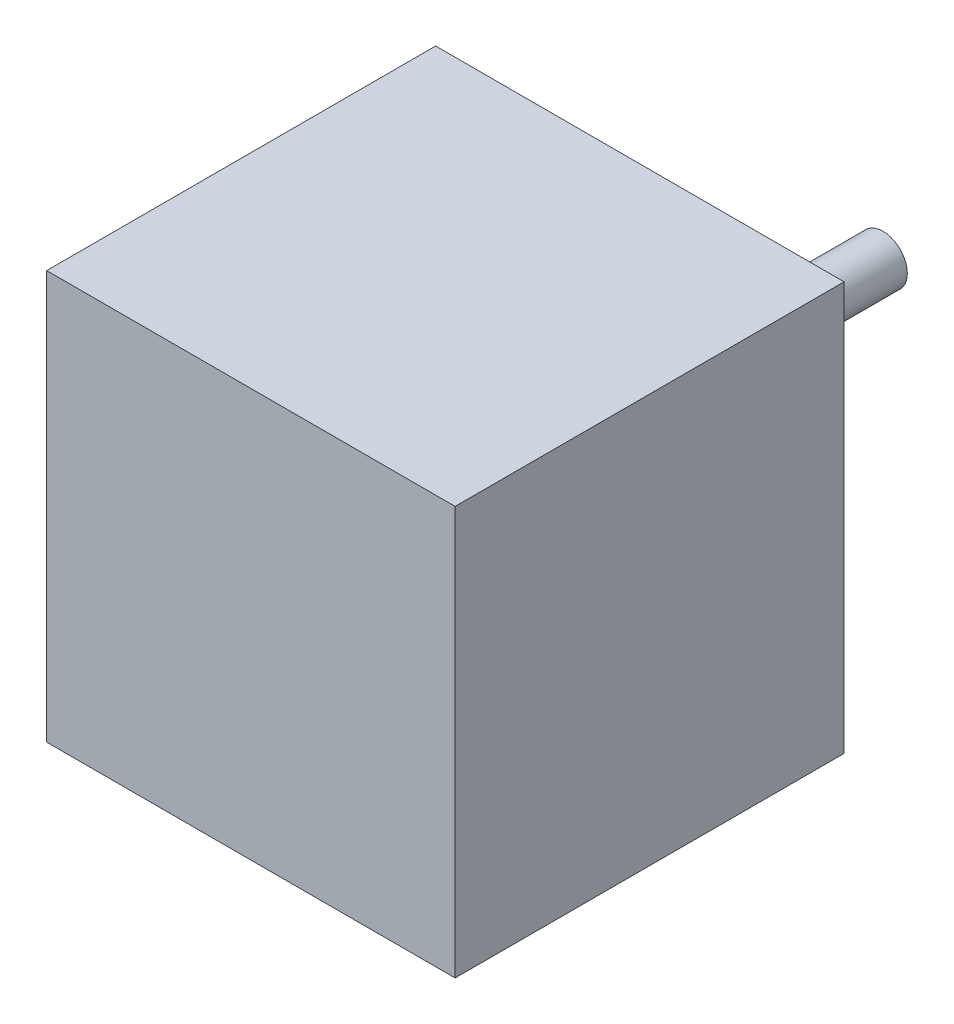
ISO-10303-21;
HEADER;
FILE_DESCRIPTION(('STEP AP214'),'2;1');
FILE_NAME('part.step','',(''),(''),'','','');
FILE_SCHEMA(('AUTOMOTIVE_DESIGN { 1 0 10303 214 1 1 1 1 }'));
ENDSEC;
DATA;
#1=APPLICATION_CONTEXT('core data for automotive mechanical design processes');
#2=APPLICATION_PROTOCOL_DEFINITION('international standard','automotive_design',2000,#1);
#3=PRODUCT_CONTEXT('',#1,'mechanical');
#4=PRODUCT('Part','Part','',(#3));
#5=PRODUCT_RELATED_PRODUCT_CATEGORY('part','',(#4));
#6=PRODUCT_DEFINITION_FORMATION('','',#4);
#7=PRODUCT_DEFINITION_CONTEXT('part definition',#1,'design');
#8=PRODUCT_DEFINITION('design','',#6,#7);
#9=PRODUCT_DEFINITION_SHAPE('','',#8);
#10=(LENGTH_UNIT() NAMED_UNIT(*) SI_UNIT(.MILLI.,.METRE.));
#11=(NAMED_UNIT(*) PLANE_ANGLE_UNIT() SI_UNIT($,.RADIAN.));
#12=(NAMED_UNIT(*) SI_UNIT($,.STERADIAN.) SOLID_ANGLE_UNIT());
#13=UNCERTAINTY_MEASURE_WITH_UNIT(LENGTH_MEASURE(1.E-05),#10,'distance_accuracy_value','');
#14=(GEOMETRIC_REPRESENTATION_CONTEXT(3) GLOBAL_UNCERTAINTY_ASSIGNED_CONTEXT((#13)) GLOBAL_UNIT_ASSIGNED_CONTEXT((#10,
#11,#12)) REPRESENTATION_CONTEXT('',''));
#15=CARTESIAN_POINT('',(0.,0.,0.));
#16=DIRECTION('',(0.,0.,1.));
#17=DIRECTION('',(1.,0.,0.));
#18=AXIS2_PLACEMENT_3D('',#15,#16,#17);
#19=CARTESIAN_POINT('',(0.,-21.,40.));
#20=DIRECTION('',(0.,1.,0.));
#21=DIRECTION('',(0.,0.,1.));
#22=AXIS2_PLACEMENT_3D('',#19,#20,#21);
#23=PLANE('',#22);
#24=DIRECTION('',(1.,0.,0.));
#25=VECTOR('',#24,1.);
#26=CARTESIAN_POINT('',(0.,-21.,0.));
#27=LINE('',#26,#25);
#28=CARTESIAN_POINT('',(-21.,-21.,0.));
#29=VERTEX_POINT('',#28);
#30=CARTESIAN_POINT('',(21.,-21.,0.));
#31=VERTEX_POINT('',#30);
#32=EDGE_CURVE('E100',#29,#31,#27,.T.);
#33=ORIENTED_EDGE('',*,*,#32,.T.);
#34=DIRECTION('',(0.,0.,-1.));
#35=VECTOR('',#34,1.);
#36=CARTESIAN_POINT('',(21.,-21.,40.));
#37=LINE('',#36,#35);
#38=CARTESIAN_POINT('',(21.,-21.,40.));
#39=VERTEX_POINT('',#38);
#40=EDGE_CURVE('E11',#39,#31,#37,.T.);
#41=ORIENTED_EDGE('',*,*,#40,.F.);
#42=DIRECTION('',(1.,0.,0.));
#43=VECTOR('',#42,1.);
#44=CARTESIAN_POINT('',(0.,-21.,40.));
#45=LINE('',#44,#43);
#46=CARTESIAN_POINT('',(-21.,-21.,40.));
#47=VERTEX_POINT('',#46);
#48=EDGE_CURVE('E85',#47,#39,#45,.T.);
#49=ORIENTED_EDGE('',*,*,#48,.F.);
#50=DIRECTION('',(0.,0.,-1.));
#51=VECTOR('',#50,1.);
#52=CARTESIAN_POINT('',(-21.,-21.,40.));
#53=LINE('',#52,#51);
#54=EDGE_CURVE('E52',#47,#29,#53,.T.);
#55=ORIENTED_EDGE('',*,*,#54,.T.);
#56=EDGE_LOOP('',(#33,#41,#49,#55));
#57=FACE_BOUND('',#56,.T.);
#58=ADVANCED_FACE('F35',(#57),#23,.F.);
#59=CARTESIAN_POINT('',(21.,0.,40.));
#60=DIRECTION('',(-1.,0.,0.));
#61=DIRECTION('',(0.,0.,1.));
#62=AXIS2_PLACEMENT_3D('',#59,#60,#61);
#63=PLANE('',#62);
#64=DIRECTION('',(0.,1.,0.));
#65=VECTOR('',#64,1.);
#66=CARTESIAN_POINT('',(21.,0.,0.));
#67=LINE('',#66,#65);
#68=CARTESIAN_POINT('',(21.,21.,0.));
#69=VERTEX_POINT('',#68);
#70=EDGE_CURVE('E90',#31,#69,#67,.T.);
#71=ORIENTED_EDGE('',*,*,#70,.T.);
#72=DIRECTION('',(0.,0.,-1.));
#73=VECTOR('',#72,1.);
#74=CARTESIAN_POINT('',(21.,21.,40.));
#75=LINE('',#74,#73);
#76=CARTESIAN_POINT('',(21.,21.,40.));
#77=VERTEX_POINT('',#76);
#78=EDGE_CURVE('E44',#77,#69,#75,.T.);
#79=ORIENTED_EDGE('',*,*,#78,.F.);
#80=DIRECTION('',(0.,1.,0.));
#81=VECTOR('',#80,1.);
#82=CARTESIAN_POINT('',(21.,0.,40.));
#83=LINE('',#82,#81);
#84=EDGE_CURVE('E77',#39,#77,#83,.T.);
#85=ORIENTED_EDGE('',*,*,#84,.F.);
#86=ORIENTED_EDGE('',*,*,#40,.T.);
#87=EDGE_LOOP('',(#71,#79,#85,#86));
#88=FACE_BOUND('',#87,.T.);
#89=ADVANCED_FACE('F89',(#88),#63,.F.);
#90=CARTESIAN_POINT('',(0.,21.,40.));
#91=DIRECTION('',(0.,1.,0.));
#92=DIRECTION('',(0.,0.,1.));
#93=AXIS2_PLACEMENT_3D('',#90,#91,#92);
#94=PLANE('',#93);
#95=DIRECTION('',(1.,0.,0.));
#96=VECTOR('',#95,1.);
#97=CARTESIAN_POINT('',(0.,21.,0.));
#98=LINE('',#97,#96);
#99=CARTESIAN_POINT('',(-21.,21.,0.));
#100=VERTEX_POINT('',#99);
#101=EDGE_CURVE('E104',#100,#69,#98,.T.);
#102=ORIENTED_EDGE('',*,*,#101,.F.);
#103=DIRECTION('',(0.,0.,-1.));
#104=VECTOR('',#103,1.);
#105=CARTESIAN_POINT('',(-21.,21.,40.));
#106=LINE('',#105,#104);
#107=CARTESIAN_POINT('',(-21.,21.,40.));
#108=VERTEX_POINT('',#107);
#109=EDGE_CURVE('E66',#108,#100,#106,.T.);
#110=ORIENTED_EDGE('',*,*,#109,.F.);
#111=DIRECTION('',(1.,0.,0.));
#112=VECTOR('',#111,1.);
#113=CARTESIAN_POINT('',(0.,21.,40.));
#114=LINE('',#113,#112);
#115=EDGE_CURVE('E84',#108,#77,#114,.T.);
#116=ORIENTED_EDGE('',*,*,#115,.T.);
#117=ORIENTED_EDGE('',*,*,#78,.T.);
#118=EDGE_LOOP('',(#102,#110,#116,#117));
#119=FACE_BOUND('',#118,.T.);
#120=ADVANCED_FACE('F94',(#119),#94,.T.);
#121=CARTESIAN_POINT('',(-21.,0.,40.));
#122=DIRECTION('',(-1.,0.,0.));
#123=DIRECTION('',(0.,0.,1.));
#124=AXIS2_PLACEMENT_3D('',#121,#122,#123);
#125=PLANE('',#124);
#126=DIRECTION('',(0.,1.,0.));
#127=VECTOR('',#126,1.);
#128=CARTESIAN_POINT('',(-21.,0.,0.));
#129=LINE('',#128,#127);
#130=EDGE_CURVE('E106',#29,#100,#129,.T.);
#131=ORIENTED_EDGE('',*,*,#130,.F.);
#132=ORIENTED_EDGE('',*,*,#54,.F.);
#133=DIRECTION('',(0.,1.,0.));
#134=VECTOR('',#133,1.);
#135=CARTESIAN_POINT('',(-21.,0.,40.));
#136=LINE('',#135,#134);
#137=EDGE_CURVE('E95',#47,#108,#136,.T.);
#138=ORIENTED_EDGE('',*,*,#137,.T.);
#139=ORIENTED_EDGE('',*,*,#109,.T.);
#140=EDGE_LOOP('',(#131,#132,#138,#139));
#141=FACE_BOUND('',#140,.T.);
#142=ADVANCED_FACE('F144',(#141),#125,.T.);
#143=CARTESIAN_POINT('',(0.,0.,40.));
#144=DIRECTION('',(0.,0.,1.));
#145=DIRECTION('',(1.,0.,0.));
#146=AXIS2_PLACEMENT_3D('',#143,#144,#145);
#147=PLANE('',#146);
#148=ORIENTED_EDGE('',*,*,#48,.T.);
#149=ORIENTED_EDGE('',*,*,#84,.T.);
#150=ORIENTED_EDGE('',*,*,#115,.F.);
#151=ORIENTED_EDGE('',*,*,#137,.F.);
#152=EDGE_LOOP('',(#148,#149,#150,#151));
#153=FACE_BOUND('',#152,.T.);
#154=ADVANCED_FACE('F81',(#153),#147,.T.);
#155=CARTESIAN_POINT('',(0.,0.,0.));
#156=DIRECTION('',(0.,0.,1.));
#157=DIRECTION('',(1.,0.,0.));
#158=AXIS2_PLACEMENT_3D('',#155,#156,#157);
#159=PLANE('',#158);
#160=CARTESIAN_POINT('',(0.,0.,0.));
#161=DIRECTION('',(0.,0.,1.));
#162=DIRECTION('',(1.,0.,0.));
#163=AXIS2_PLACEMENT_3D('',#160,#161,#162);
#164=CIRCLE('',#163,11.5);
#165=CARTESIAN_POINT('',(11.5,0.,0.));
#166=VERTEX_POINT('',#165);
#167=EDGE_CURVE('E112',#166,#166,#164,.T.);
#168=ORIENTED_EDGE('',*,*,#167,.T.);
#169=EDGE_LOOP('',(#168));
#170=FACE_BOUND('',#169,.T.);
#171=ORIENTED_EDGE('',*,*,#32,.F.);
#172=ORIENTED_EDGE('',*,*,#130,.T.);
#173=ORIENTED_EDGE('',*,*,#101,.T.);
#174=ORIENTED_EDGE('',*,*,#70,.F.);
#175=EDGE_LOOP('',(#171,#172,#173,#174));
#176=FACE_BOUND('',#175,.T.);
#177=ADVANCED_FACE('F143',(#170,#176),#159,.F.);
#178=CARTESIAN_POINT('',(0.,0.,-2.));
#179=DIRECTION('',(0.,0.,1.));
#180=DIRECTION('',(1.,0.,0.));
#181=AXIS2_PLACEMENT_3D('',#178,#179,#180);
#182=CYLINDRICAL_SURFACE('',#181,11.5);
#183=CARTESIAN_POINT('',(0.,0.,-2.));
#184=DIRECTION('',(0.,0.,1.));
#185=DIRECTION('',(1.,0.,0.));
#186=AXIS2_PLACEMENT_3D('',#183,#184,#185);
#187=CIRCLE('',#186,11.5);
#188=CARTESIAN_POINT('',(11.5,0.,-2.));
#189=VERTEX_POINT('',#188);
#190=EDGE_CURVE('E102',#189,#189,#187,.T.);
#191=ORIENTED_EDGE('',*,*,#190,.T.);
#192=EDGE_LOOP('',(#191));
#193=FACE_BOUND('',#192,.T.);
#194=ORIENTED_EDGE('',*,*,#167,.F.);
#195=EDGE_LOOP('',(#194));
#196=FACE_BOUND('',#195,.T.);
#197=ADVANCED_FACE('F137',(#193,#196),#182,.T.);
#198=CARTESIAN_POINT('',(0.,0.,-2.));
#199=DIRECTION('',(0.,0.,1.));
#200=DIRECTION('',(1.,0.,0.));
#201=AXIS2_PLACEMENT_3D('',#198,#199,#200);
#202=PLANE('',#201);
#203=CARTESIAN_POINT('',(0.,0.,-2.));
#204=DIRECTION('',(0.,0.,1.));
#205=DIRECTION('',(1.,0.,0.));
#206=AXIS2_PLACEMENT_3D('',#203,#204,#205);
#207=CIRCLE('',#206,2.5);
#208=CARTESIAN_POINT('',(2.5,0.,-2.));
#209=VERTEX_POINT('',#208);
#210=EDGE_CURVE('E38',#209,#209,#207,.T.);
#211=ORIENTED_EDGE('',*,*,#210,.T.);
#212=EDGE_LOOP('',(#211));
#213=FACE_BOUND('',#212,.T.);
#214=ORIENTED_EDGE('',*,*,#190,.F.);
#215=EDGE_LOOP('',(#214));
#216=FACE_BOUND('',#215,.T.);
#217=ADVANCED_FACE('F124',(#213,#216),#202,.F.);
#218=CARTESIAN_POINT('',(0.,0.,-25.));
#219=DIRECTION('',(0.,0.,1.));
#220=DIRECTION('',(1.,0.,0.));
#221=AXIS2_PLACEMENT_3D('',#218,#219,#220);
#222=CYLINDRICAL_SURFACE('',#221,2.5);
#223=CARTESIAN_POINT('',(0.,0.,-25.));
#224=DIRECTION('',(0.,0.,1.));
#225=DIRECTION('',(1.,0.,0.));
#226=AXIS2_PLACEMENT_3D('',#223,#224,#225);
#227=CIRCLE('',#226,2.5);
#228=CARTESIAN_POINT('',(2.5,0.,-25.));
#229=VERTEX_POINT('',#228);
#230=EDGE_CURVE('E117',#229,#229,#227,.T.);
#231=ORIENTED_EDGE('',*,*,#230,.T.);
#232=EDGE_LOOP('',(#231));
#233=FACE_BOUND('',#232,.T.);
#234=ORIENTED_EDGE('',*,*,#210,.F.);
#235=EDGE_LOOP('',(#234));
#236=FACE_BOUND('',#235,.T.);
#237=ADVANCED_FACE('F127',(#233,#236),#222,.T.);
#238=CARTESIAN_POINT('',(0.,0.,-25.));
#239=DIRECTION('',(0.,0.,1.));
#240=DIRECTION('',(1.,0.,0.));
#241=AXIS2_PLACEMENT_3D('',#238,#239,#240);
#242=PLANE('',#241);
#243=ORIENTED_EDGE('',*,*,#230,.F.);
#244=EDGE_LOOP('',(#243));
#245=FACE_BOUND('',#244,.T.);
#246=ADVANCED_FACE('F129',(#245),#242,.F.);
#247=CLOSED_SHELL('',(#58,#89,#120,#142,#154,#177,#197,#217,#237,#246));
#248=MANIFOLD_SOLID_BREP('B2',#247);
#249=ADVANCED_BREP_SHAPE_REPRESENTATION('',(#18,#248),#14);
#250=SHAPE_DEFINITION_REPRESENTATION(#9,#249);
ENDSEC;
END-ISO-10303-21;
